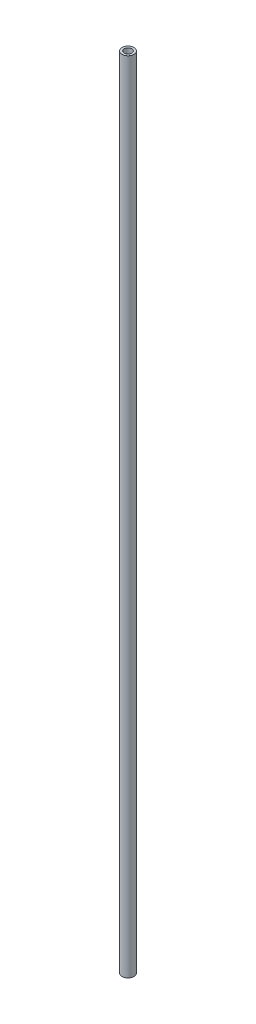
ISO-10303-21;
HEADER;
FILE_DESCRIPTION(('STEP AP214'),'2;1');
FILE_NAME('part.step','',(''),(''),'','','');
FILE_SCHEMA(('AUTOMOTIVE_DESIGN { 1 0 10303 214 1 1 1 1 }'));
ENDSEC;
DATA;
#1=APPLICATION_CONTEXT('core data for automotive mechanical design processes');
#2=APPLICATION_PROTOCOL_DEFINITION('international standard','automotive_design',2000,#1);
#3=PRODUCT_CONTEXT('',#1,'mechanical');
#4=PRODUCT('Part','Part','',(#3));
#5=PRODUCT_RELATED_PRODUCT_CATEGORY('part','',(#4));
#6=PRODUCT_DEFINITION_FORMATION('','',#4);
#7=PRODUCT_DEFINITION_CONTEXT('part definition',#1,'design');
#8=PRODUCT_DEFINITION('design','',#6,#7);
#9=PRODUCT_DEFINITION_SHAPE('','',#8);
#10=(LENGTH_UNIT() NAMED_UNIT(*) SI_UNIT(.MILLI.,.METRE.));
#11=(NAMED_UNIT(*) PLANE_ANGLE_UNIT() SI_UNIT($,.RADIAN.));
#12=(NAMED_UNIT(*) SI_UNIT($,.STERADIAN.) SOLID_ANGLE_UNIT());
#13=UNCERTAINTY_MEASURE_WITH_UNIT(LENGTH_MEASURE(1.E-05),#10,'distance_accuracy_value','');
#14=(GEOMETRIC_REPRESENTATION_CONTEXT(3) GLOBAL_UNCERTAINTY_ASSIGNED_CONTEXT((#13)) GLOBAL_UNIT_ASSIGNED_CONTEXT((#10,
#11,#12)) REPRESENTATION_CONTEXT('',''));
#15=CARTESIAN_POINT('',(0.,0.,0.));
#16=DIRECTION('',(0.,0.,1.));
#17=DIRECTION('',(1.,0.,0.));
#18=AXIS2_PLACEMENT_3D('',#15,#16,#17);
#19=CARTESIAN_POINT('',(0.,133.2,0.));
#20=DIRECTION('',(0.,-1.,0.));
#21=DIRECTION('',(0.,0.,-1.));
#22=AXIS2_PLACEMENT_3D('',#19,#20,#21);
#23=CYLINDRICAL_SURFACE('',#22,1.);
#24=CARTESIAN_POINT('',(0.,133.2,0.));
#25=DIRECTION('',(0.,1.,0.));
#26=DIRECTION('',(0.,0.,1.));
#27=AXIS2_PLACEMENT_3D('',#24,#25,#26);
#28=CIRCLE('',#27,1.);
#29=CARTESIAN_POINT('',(0.,133.2,1.));
#30=VERTEX_POINT('',#29);
#31=EDGE_CURVE('E11',#30,#30,#28,.T.);
#32=ORIENTED_EDGE('',*,*,#31,.F.);
#33=EDGE_LOOP('',(#32));
#34=FACE_BOUND('',#33,.T.);
#35=CARTESIAN_POINT('',(0.,0.,0.));
#36=DIRECTION('',(0.,1.,0.));
#37=DIRECTION('',(0.,0.,1.));
#38=AXIS2_PLACEMENT_3D('',#35,#36,#37);
#39=CIRCLE('',#38,1.);
#40=CARTESIAN_POINT('',(0.,0.,1.));
#41=VERTEX_POINT('',#40);
#42=EDGE_CURVE('E42',#41,#41,#39,.T.);
#43=ORIENTED_EDGE('',*,*,#42,.T.);
#44=EDGE_LOOP('',(#43));
#45=FACE_BOUND('',#44,.T.);
#46=ADVANCED_FACE('F39',(#34,#45),#23,.T.);
#47=CARTESIAN_POINT('',(0.,133.2,0.));
#48=DIRECTION('',(0.,1.,0.));
#49=DIRECTION('',(0.,0.,1.));
#50=AXIS2_PLACEMENT_3D('',#47,#48,#49);
#51=PLANE('',#50);
#52=CARTESIAN_POINT('',(0.,133.2,0.));
#53=DIRECTION('',(0.,1.,0.));
#54=DIRECTION('',(0.,0.,1.));
#55=AXIS2_PLACEMENT_3D('',#52,#53,#54);
#56=CIRCLE('',#55,0.624999999999999);
#57=CARTESIAN_POINT('',(0.,133.2,0.624999999999999));
#58=VERTEX_POINT('',#57);
#59=EDGE_CURVE('E62',#58,#58,#56,.T.);
#60=ORIENTED_EDGE('',*,*,#59,.F.);
#61=EDGE_LOOP('',(#60));
#62=FACE_BOUND('',#61,.T.);
#63=ORIENTED_EDGE('',*,*,#31,.T.);
#64=EDGE_LOOP('',(#63));
#65=FACE_BOUND('',#64,.T.);
#66=ADVANCED_FACE('F81',(#62,#65),#51,.T.);
#67=CARTESIAN_POINT('',(0.,0.,0.));
#68=DIRECTION('',(0.,1.,0.));
#69=DIRECTION('',(0.,0.,1.));
#70=AXIS2_PLACEMENT_3D('',#67,#68,#69);
#71=PLANE('',#70);
#72=CARTESIAN_POINT('',(0.,0.,0.));
#73=DIRECTION('',(0.,-1.,0.));
#74=DIRECTION('',(0.,0.,-1.));
#75=AXIS2_PLACEMENT_3D('',#72,#73,#74);
#76=CIRCLE('',#75,0.624999999999999);
#77=CARTESIAN_POINT('',(0.,0.,-0.624999999999999));
#78=VERTEX_POINT('',#77);
#79=EDGE_CURVE('E63',#78,#78,#76,.T.);
#80=ORIENTED_EDGE('',*,*,#79,.F.);
#81=EDGE_LOOP('',(#80));
#82=FACE_BOUND('',#81,.T.);
#83=ORIENTED_EDGE('',*,*,#42,.F.);
#84=EDGE_LOOP('',(#83));
#85=FACE_BOUND('',#84,.T.);
#86=ADVANCED_FACE('F78',(#82,#85),#71,.F.);
#87=CARTESIAN_POINT('',(0.,127.2,0.));
#88=DIRECTION('',(0.,1.,0.));
#89=DIRECTION('',(0.,0.,1.));
#90=AXIS2_PLACEMENT_3D('',#87,#88,#89);
#91=CONICAL_SURFACE('',#90,0.624999999999999,1.02974425867667);
#92=CARTESIAN_POINT('',(0.,126.824462113108,0.));
#93=VERTEX_POINT('',#92);
#94=VERTEX_LOOP('',#93);
#95=FACE_BOUND('',#94,.T.);
#96=CARTESIAN_POINT('',(0.,127.2,0.));
#97=DIRECTION('',(0.,1.,0.));
#98=DIRECTION('',(0.,0.,1.));
#99=AXIS2_PLACEMENT_3D('',#96,#97,#98);
#100=CIRCLE('',#99,0.624999999999999);
#101=CARTESIAN_POINT('',(0.,127.2,0.624999999999999));
#102=VERTEX_POINT('',#101);
#103=EDGE_CURVE('E66',#102,#102,#100,.T.);
#104=ORIENTED_EDGE('',*,*,#103,.T.);
#105=EDGE_LOOP('',(#104));
#106=FACE_BOUND('',#105,.T.);
#107=ADVANCED_FACE('F80',(#95,#106),#91,.F.);
#108=CARTESIAN_POINT('',(0.,133.2,0.));
#109=DIRECTION('',(0.,1.,0.));
#110=DIRECTION('',(0.,0.,1.));
#111=AXIS2_PLACEMENT_3D('',#108,#109,#110);
#112=CYLINDRICAL_SURFACE('',#111,0.624999999999999);
#113=ORIENTED_EDGE('',*,*,#103,.F.);
#114=EDGE_LOOP('',(#113));
#115=FACE_BOUND('',#114,.T.);
#116=ORIENTED_EDGE('',*,*,#59,.T.);
#117=EDGE_LOOP('',(#116));
#118=FACE_BOUND('',#117,.T.);
#119=ADVANCED_FACE('F56',(#115,#118),#112,.F.);
#120=CARTESIAN_POINT('',(0.,6.,0.));
#121=DIRECTION('',(0.,-1.,0.));
#122=DIRECTION('',(0.,0.,-1.));
#123=AXIS2_PLACEMENT_3D('',#120,#121,#122);
#124=CONICAL_SURFACE('',#123,0.624999999999999,1.02974425867665);
#125=CARTESIAN_POINT('',(0.,6.37553788689223,0.));
#126=VERTEX_POINT('',#125);
#127=VERTEX_LOOP('',#126);
#128=FACE_BOUND('',#127,.T.);
#129=CARTESIAN_POINT('',(0.,6.,0.));
#130=DIRECTION('',(0.,-1.,0.));
#131=DIRECTION('',(0.,0.,-1.));
#132=AXIS2_PLACEMENT_3D('',#129,#130,#131);
#133=CIRCLE('',#132,0.624999999999999);
#134=CARTESIAN_POINT('',(0.,6.,-0.624999999999999));
#135=VERTEX_POINT('',#134);
#136=EDGE_CURVE('E60',#135,#135,#133,.T.);
#137=ORIENTED_EDGE('',*,*,#136,.T.);
#138=EDGE_LOOP('',(#137));
#139=FACE_BOUND('',#138,.T.);
#140=ADVANCED_FACE('F52',(#128,#139),#124,.F.);
#141=CARTESIAN_POINT('',(0.,0.,0.));
#142=DIRECTION('',(0.,-1.,0.));
#143=DIRECTION('',(0.,0.,-1.));
#144=AXIS2_PLACEMENT_3D('',#141,#142,#143);
#145=CYLINDRICAL_SURFACE('',#144,0.624999999999999);
#146=ORIENTED_EDGE('',*,*,#136,.F.);
#147=EDGE_LOOP('',(#146));
#148=FACE_BOUND('',#147,.T.);
#149=ORIENTED_EDGE('',*,*,#79,.T.);
#150=EDGE_LOOP('',(#149));
#151=FACE_BOUND('',#150,.T.);
#152=ADVANCED_FACE('F55',(#148,#151),#145,.F.);
#153=CLOSED_SHELL('',(#46,#66,#86,#107,#119,#140,#152));
#154=MANIFOLD_SOLID_BREP('B2',#153);
#155=ADVANCED_BREP_SHAPE_REPRESENTATION('',(#18,#154),#14);
#156=SHAPE_DEFINITION_REPRESENTATION(#9,#155);
ENDSEC;
END-ISO-10303-21;
